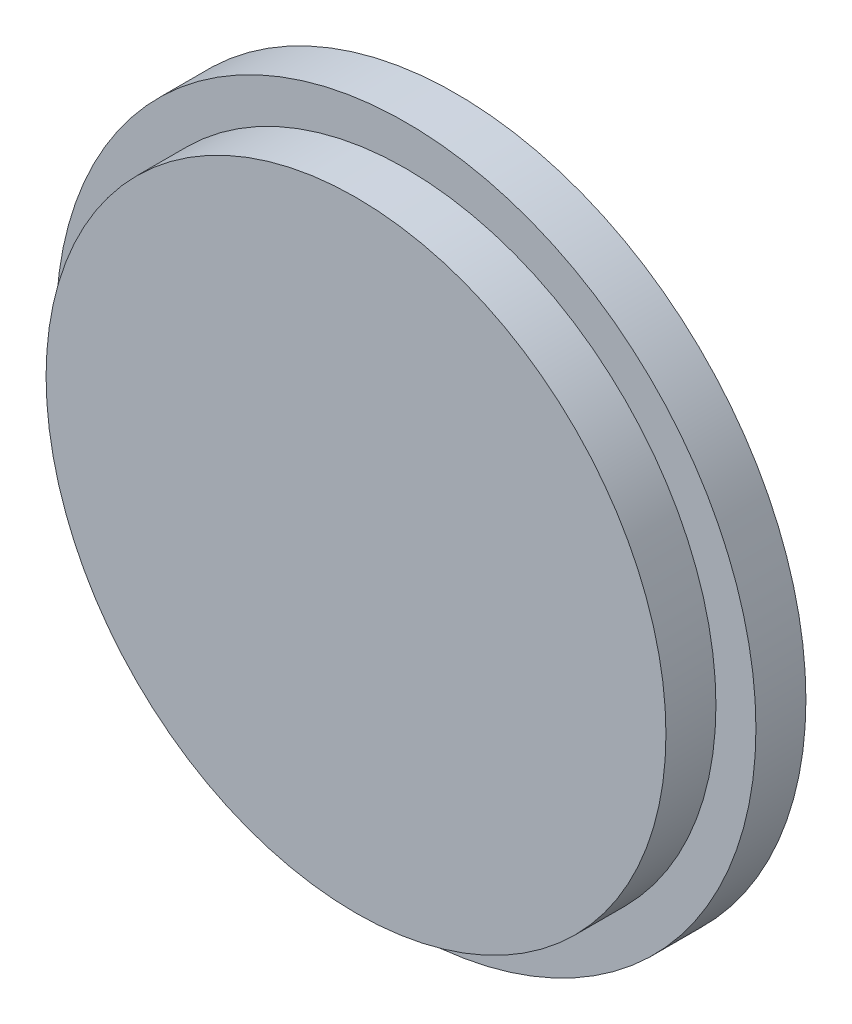
ISO-10303-21;
HEADER;
FILE_DESCRIPTION(('STEP AP214'),'2;1');
FILE_NAME('part.step','',(''),(''),'','','');
FILE_SCHEMA(('AUTOMOTIVE_DESIGN { 1 0 10303 214 1 1 1 1 }'));
ENDSEC;
DATA;
#1=APPLICATION_CONTEXT('core data for automotive mechanical design processes');
#2=APPLICATION_PROTOCOL_DEFINITION('international standard','automotive_design',2000,#1);
#3=PRODUCT_CONTEXT('',#1,'mechanical');
#4=PRODUCT('Part','Part','',(#3));
#5=PRODUCT_RELATED_PRODUCT_CATEGORY('part','',(#4));
#6=PRODUCT_DEFINITION_FORMATION('','',#4);
#7=PRODUCT_DEFINITION_CONTEXT('part definition',#1,'design');
#8=PRODUCT_DEFINITION('design','',#6,#7);
#9=PRODUCT_DEFINITION_SHAPE('','',#8);
#10=(LENGTH_UNIT() NAMED_UNIT(*) SI_UNIT(.MILLI.,.METRE.));
#11=(NAMED_UNIT(*) PLANE_ANGLE_UNIT() SI_UNIT($,.RADIAN.));
#12=(NAMED_UNIT(*) SI_UNIT($,.STERADIAN.) SOLID_ANGLE_UNIT());
#13=UNCERTAINTY_MEASURE_WITH_UNIT(LENGTH_MEASURE(1.E-05),#10,'distance_accuracy_value','');
#14=(GEOMETRIC_REPRESENTATION_CONTEXT(3) GLOBAL_UNCERTAINTY_ASSIGNED_CONTEXT((#13)) GLOBAL_UNIT_ASSIGNED_CONTEXT((#10,
#11,#12)) REPRESENTATION_CONTEXT('',''));
#15=CARTESIAN_POINT('',(0.,0.,0.));
#16=DIRECTION('',(0.,0.,1.));
#17=DIRECTION('',(1.,0.,0.));
#18=AXIS2_PLACEMENT_3D('',#15,#16,#17);
#19=CARTESIAN_POINT('',(0.,0.,5.));
#20=DIRECTION('',(0.,0.,-1.));
#21=DIRECTION('',(-1.,0.,0.));
#22=AXIS2_PLACEMENT_3D('',#19,#20,#21);
#23=CYLINDRICAL_SURFACE('',#22,35.);
#24=CARTESIAN_POINT('',(0.,0.,5.));
#25=DIRECTION('',(0.,0.,1.));
#26=DIRECTION('',(1.,0.,0.));
#27=AXIS2_PLACEMENT_3D('',#24,#25,#26);
#28=CIRCLE('',#27,35.);
#29=CARTESIAN_POINT('',(35.,0.,5.));
#30=VERTEX_POINT('',#29);
#31=EDGE_CURVE('E45',#30,#30,#28,.T.);
#32=ORIENTED_EDGE('',*,*,#31,.F.);
#33=EDGE_LOOP('',(#32));
#34=FACE_BOUND('',#33,.T.);
#35=CARTESIAN_POINT('',(0.,0.,0.));
#36=DIRECTION('',(0.,0.,1.));
#37=DIRECTION('',(1.,0.,0.));
#38=AXIS2_PLACEMENT_3D('',#35,#36,#37);
#39=CIRCLE('',#38,35.);
#40=CARTESIAN_POINT('',(35.,0.,0.));
#41=VERTEX_POINT('',#40);
#42=EDGE_CURVE('E40',#41,#41,#39,.T.);
#43=ORIENTED_EDGE('',*,*,#42,.T.);
#44=EDGE_LOOP('',(#43));
#45=FACE_BOUND('',#44,.T.);
#46=ADVANCED_FACE('F37',(#34,#45),#23,.T.);
#47=CARTESIAN_POINT('',(0.,0.,5.));
#48=DIRECTION('',(0.,0.,1.));
#49=DIRECTION('',(1.,0.,0.));
#50=AXIS2_PLACEMENT_3D('',#47,#48,#49);
#51=PLANE('',#50);
#52=CARTESIAN_POINT('',(0.,0.,5.));
#53=DIRECTION('',(0.,0.,1.));
#54=DIRECTION('',(1.,0.,0.));
#55=AXIS2_PLACEMENT_3D('',#52,#53,#54);
#56=CIRCLE('',#55,31.);
#57=CARTESIAN_POINT('',(31.,0.,5.));
#58=VERTEX_POINT('',#57);
#59=EDGE_CURVE('E10',#58,#58,#56,.T.);
#60=ORIENTED_EDGE('',*,*,#59,.F.);
#61=EDGE_LOOP('',(#60));
#62=FACE_BOUND('',#61,.T.);
#63=ORIENTED_EDGE('',*,*,#31,.T.);
#64=EDGE_LOOP('',(#63));
#65=FACE_BOUND('',#64,.T.);
#66=ADVANCED_FACE('F65',(#62,#65),#51,.T.);
#67=CARTESIAN_POINT('',(0.,0.,0.));
#68=DIRECTION('',(0.,0.,1.));
#69=DIRECTION('',(1.,0.,0.));
#70=AXIS2_PLACEMENT_3D('',#67,#68,#69);
#71=PLANE('',#70);
#72=ORIENTED_EDGE('',*,*,#42,.F.);
#73=EDGE_LOOP('',(#72));
#74=FACE_BOUND('',#73,.T.);
#75=ADVANCED_FACE('F62',(#74),#71,.F.);
#76=CARTESIAN_POINT('',(0.,0.,10.));
#77=DIRECTION('',(0.,0.,-1.));
#78=DIRECTION('',(-1.,0.,0.));
#79=AXIS2_PLACEMENT_3D('',#76,#77,#78);
#80=CYLINDRICAL_SURFACE('',#79,31.);
#81=CARTESIAN_POINT('',(0.,0.,10.));
#82=DIRECTION('',(0.,0.,1.));
#83=DIRECTION('',(1.,0.,0.));
#84=AXIS2_PLACEMENT_3D('',#81,#82,#83);
#85=CIRCLE('',#84,31.);
#86=CARTESIAN_POINT('',(31.,0.,10.));
#87=VERTEX_POINT('',#86);
#88=EDGE_CURVE('E52',#87,#87,#85,.T.);
#89=ORIENTED_EDGE('',*,*,#88,.F.);
#90=EDGE_LOOP('',(#89));
#91=FACE_BOUND('',#90,.T.);
#92=ORIENTED_EDGE('',*,*,#59,.T.);
#93=EDGE_LOOP('',(#92));
#94=FACE_BOUND('',#93,.T.);
#95=ADVANCED_FACE('F64',(#91,#94),#80,.T.);
#96=CARTESIAN_POINT('',(0.,0.,10.));
#97=DIRECTION('',(0.,0.,1.));
#98=DIRECTION('',(1.,0.,0.));
#99=AXIS2_PLACEMENT_3D('',#96,#97,#98);
#100=PLANE('',#99);
#101=ORIENTED_EDGE('',*,*,#88,.T.);
#102=EDGE_LOOP('',(#101));
#103=FACE_BOUND('',#102,.T.);
#104=ADVANCED_FACE('F70',(#103),#100,.T.);
#105=CLOSED_SHELL('',(#46,#66,#75,#95,#104));
#106=MANIFOLD_SOLID_BREP('B2',#105);
#107=ADVANCED_BREP_SHAPE_REPRESENTATION('',(#18,#106),#14);
#108=SHAPE_DEFINITION_REPRESENTATION(#9,#107);
ENDSEC;
END-ISO-10303-21;
